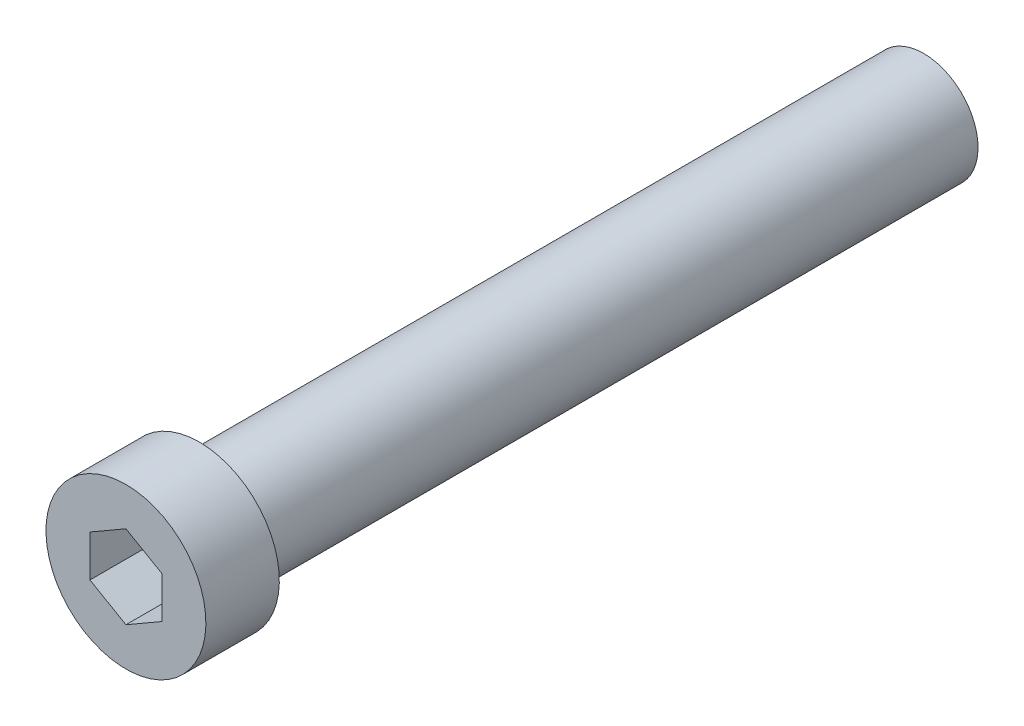
ISO-10303-21;
HEADER;
FILE_DESCRIPTION(('STEP AP214'),'2;1');
FILE_NAME('part.step','',(''),(''),'','','');
FILE_SCHEMA(('AUTOMOTIVE_DESIGN { 1 0 10303 214 1 1 1 1 }'));
ENDSEC;
DATA;
#1=APPLICATION_CONTEXT('core data for automotive mechanical design processes');
#2=APPLICATION_PROTOCOL_DEFINITION('international standard','automotive_design',2000,#1);
#3=PRODUCT_CONTEXT('',#1,'mechanical');
#4=PRODUCT('Part','Part','',(#3));
#5=PRODUCT_RELATED_PRODUCT_CATEGORY('part','',(#4));
#6=PRODUCT_DEFINITION_FORMATION('','',#4);
#7=PRODUCT_DEFINITION_CONTEXT('part definition',#1,'design');
#8=PRODUCT_DEFINITION('design','',#6,#7);
#9=PRODUCT_DEFINITION_SHAPE('','',#8);
#10=(LENGTH_UNIT() NAMED_UNIT(*) SI_UNIT(.MILLI.,.METRE.));
#11=(NAMED_UNIT(*) PLANE_ANGLE_UNIT() SI_UNIT($,.RADIAN.));
#12=(NAMED_UNIT(*) SI_UNIT($,.STERADIAN.) SOLID_ANGLE_UNIT());
#13=UNCERTAINTY_MEASURE_WITH_UNIT(LENGTH_MEASURE(1.E-05),#10,'distance_accuracy_value','');
#14=(GEOMETRIC_REPRESENTATION_CONTEXT(3) GLOBAL_UNCERTAINTY_ASSIGNED_CONTEXT((#13)) GLOBAL_UNIT_ASSIGNED_CONTEXT((#10,
#11,#12)) REPRESENTATION_CONTEXT('',''));
#15=CARTESIAN_POINT('',(0.,0.,0.));
#16=DIRECTION('',(0.,0.,1.));
#17=DIRECTION('',(1.,0.,0.));
#18=AXIS2_PLACEMENT_3D('',#15,#16,#17);
#19=CARTESIAN_POINT('',(0.,0.,2.028));
#20=DIRECTION('',(0.,0.,-1.));
#21=DIRECTION('',(0.,1.,0.));
#22=AXIS2_PLACEMENT_3D('',#19,#20,#21);
#23=CYLINDRICAL_SURFACE('',#22,2.208);
#24=CARTESIAN_POINT('',(0.,0.,2.028));
#25=DIRECTION('',(0.,0.,-1.));
#26=DIRECTION('',(0.,1.,0.));
#27=AXIS2_PLACEMENT_3D('',#24,#25,#26);
#28=CIRCLE('',#27,2.208);
#29=CARTESIAN_POINT('',(0.,2.208,2.028));
#30=VERTEX_POINT('',#29);
#31=EDGE_CURVE('E39',#30,#30,#28,.T.);
#32=ORIENTED_EDGE('',*,*,#31,.T.);
#33=EDGE_LOOP('',(#32));
#34=FACE_BOUND('',#33,.T.);
#35=CARTESIAN_POINT('',(0.,0.,0.));
#36=DIRECTION('',(0.,0.,-1.));
#37=DIRECTION('',(0.,1.,0.));
#38=AXIS2_PLACEMENT_3D('',#35,#36,#37);
#39=CIRCLE('',#38,2.208);
#40=CARTESIAN_POINT('',(0.,2.208,0.));
#41=VERTEX_POINT('',#40);
#42=EDGE_CURVE('E145',#41,#41,#39,.T.);
#43=ORIENTED_EDGE('',*,*,#42,.F.);
#44=EDGE_LOOP('',(#43));
#45=FACE_BOUND('',#44,.T.);
#46=ADVANCED_FACE('F36',(#34,#45),#23,.T.);
#47=CARTESIAN_POINT('',(2.208,0.,2.028));
#48=DIRECTION('',(0.,0.,1.));
#49=DIRECTION('',(0.,-1.,0.));
#50=AXIS2_PLACEMENT_3D('',#47,#48,#49);
#51=PLANE('',#50);
#52=DIRECTION('',(0.866025403784439,0.5,0.));
#53=VECTOR('',#52,1.);
#54=CARTESIAN_POINT('',(0.,-1.14731045493362,2.028));
#55=LINE('',#54,#53);
#56=CARTESIAN_POINT('',(0.,-1.14731045493362,2.028));
#57=VERTEX_POINT('',#56);
#58=CARTESIAN_POINT('',(0.9936,-0.573655227466812,2.028));
#59=VERTEX_POINT('',#58);
#60=EDGE_CURVE('E51',#57,#59,#55,.T.);
#61=ORIENTED_EDGE('',*,*,#60,.F.);
#62=DIRECTION('',(0.866025403784439,-0.5,0.));
#63=VECTOR('',#62,1.);
#64=CARTESIAN_POINT('',(-0.9936,-0.573655227466812,2.028));
#65=LINE('',#64,#63);
#66=CARTESIAN_POINT('',(-0.9936,-0.573655227466812,2.028));
#67=VERTEX_POINT('',#66);
#68=EDGE_CURVE('E134',#67,#57,#65,.T.);
#69=ORIENTED_EDGE('',*,*,#68,.F.);
#70=DIRECTION('',(0.,-1.,0.));
#71=VECTOR('',#70,1.);
#72=CARTESIAN_POINT('',(-0.9936,0.573655227466811,2.028));
#73=LINE('',#72,#71);
#74=CARTESIAN_POINT('',(-0.9936,0.573655227466811,2.028));
#75=VERTEX_POINT('',#74);
#76=EDGE_CURVE('E132',#75,#67,#73,.T.);
#77=ORIENTED_EDGE('',*,*,#76,.F.);
#78=DIRECTION('',(-0.866025403784438,-0.500000000000001,0.));
#79=VECTOR('',#78,1.);
#80=CARTESIAN_POINT('',(0.,1.14731045493362,2.028));
#81=LINE('',#80,#79);
#82=CARTESIAN_POINT('',(0.,1.14731045493362,2.028));
#83=VERTEX_POINT('',#82);
#84=EDGE_CURVE('E99',#83,#75,#81,.T.);
#85=ORIENTED_EDGE('',*,*,#84,.F.);
#86=DIRECTION('',(-0.866025403784438,0.500000000000001,0.));
#87=VECTOR('',#86,1.);
#88=CARTESIAN_POINT('',(0.9936,0.573655227466811,2.028));
#89=LINE('',#88,#87);
#90=CARTESIAN_POINT('',(0.9936,0.573655227466811,2.028));
#91=VERTEX_POINT('',#90);
#92=EDGE_CURVE('E128',#91,#83,#89,.T.);
#93=ORIENTED_EDGE('',*,*,#92,.F.);
#94=DIRECTION('',(0.,1.,0.));
#95=VECTOR('',#94,1.);
#96=CARTESIAN_POINT('',(0.9936,-0.573655227466812,2.028));
#97=LINE('',#96,#95);
#98=EDGE_CURVE('E125',#59,#91,#97,.T.);
#99=ORIENTED_EDGE('',*,*,#98,.F.);
#100=EDGE_LOOP('',(#61,#69,#77,#85,#93,#99));
#101=FACE_BOUND('',#100,.T.);
#102=ORIENTED_EDGE('',*,*,#31,.F.);
#103=EDGE_LOOP('',(#102));
#104=FACE_BOUND('',#103,.T.);
#105=ADVANCED_FACE('F154',(#101,#104),#51,.T.);
#106=CARTESIAN_POINT('',(0.,0.,0.));
#107=DIRECTION('',(0.,0.,-1.));
#108=DIRECTION('',(0.,1.,0.));
#109=AXIS2_PLACEMENT_3D('',#106,#107,#108);
#110=PLANE('',#109);
#111=CARTESIAN_POINT('',(0.,0.,0.));
#112=DIRECTION('',(0.,0.,-1.));
#113=DIRECTION('',(0.,1.,0.));
#114=AXIS2_PLACEMENT_3D('',#111,#112,#113);
#115=CIRCLE('',#114,1.50000000000006);
#116=CARTESIAN_POINT('',(0.,1.50000000000006,0.));
#117=VERTEX_POINT('',#116);
#118=EDGE_CURVE('E11',#117,#117,#115,.T.);
#119=ORIENTED_EDGE('',*,*,#118,.F.);
#120=EDGE_LOOP('',(#119));
#121=FACE_BOUND('',#120,.T.);
#122=ORIENTED_EDGE('',*,*,#42,.T.);
#123=EDGE_LOOP('',(#122));
#124=FACE_BOUND('',#123,.T.);
#125=ADVANCED_FACE('F156',(#121,#124),#110,.T.);
#126=CARTESIAN_POINT('',(0.,0.,-20.));
#127=DIRECTION('',(0.,0.,1.));
#128=DIRECTION('',(0.,-1.,0.));
#129=AXIS2_PLACEMENT_3D('',#126,#127,#128);
#130=CYLINDRICAL_SURFACE('',#129,1.50000000000006);
#131=CARTESIAN_POINT('',(0.,0.,-20.));
#132=DIRECTION('',(0.,0.,-1.));
#133=DIRECTION('',(0.,1.,0.));
#134=AXIS2_PLACEMENT_3D('',#131,#132,#133);
#135=CIRCLE('',#134,1.50000000000006);
#136=CARTESIAN_POINT('',(0.,1.50000000000005,-20.));
#137=VERTEX_POINT('',#136);
#138=EDGE_CURVE('E138',#137,#137,#135,.T.);
#139=ORIENTED_EDGE('',*,*,#138,.F.);
#140=EDGE_LOOP('',(#139));
#141=FACE_BOUND('',#140,.T.);
#142=ORIENTED_EDGE('',*,*,#118,.T.);
#143=EDGE_LOOP('',(#142));
#144=FACE_BOUND('',#143,.T.);
#145=ADVANCED_FACE('F162',(#141,#144),#130,.T.);
#146=CARTESIAN_POINT('',(0.,0.,-20.));
#147=DIRECTION('',(0.,0.,-1.));
#148=DIRECTION('',(0.,1.,0.));
#149=AXIS2_PLACEMENT_3D('',#146,#147,#148);
#150=PLANE('',#149);
#151=ORIENTED_EDGE('',*,*,#138,.T.);
#152=EDGE_LOOP('',(#151));
#153=FACE_BOUND('',#152,.T.);
#154=ADVANCED_FACE('F168',(#153),#150,.T.);
#155=CARTESIAN_POINT('',(0.,-1.14731045493362,0.156));
#156=DIRECTION('',(0.5,-0.866025403784439,0.));
#157=DIRECTION('',(0.866025403784439,0.5,0.));
#158=AXIS2_PLACEMENT_3D('',#155,#156,#157);
#159=PLANE('',#158);
#160=ORIENTED_EDGE('',*,*,#60,.T.);
#161=DIRECTION('',(0.,0.,1.));
#162=VECTOR('',#161,1.);
#163=CARTESIAN_POINT('',(0.9936,-0.573655227466812,0.156));
#164=LINE('',#163,#162);
#165=CARTESIAN_POINT('',(0.9936,-0.573655227466812,0.156));
#166=VERTEX_POINT('',#165);
#167=EDGE_CURVE('E81',#166,#59,#164,.T.);
#168=ORIENTED_EDGE('',*,*,#167,.F.);
#169=DIRECTION('',(0.866025403784439,0.5,0.));
#170=VECTOR('',#169,1.);
#171=CARTESIAN_POINT('',(0.,-1.14731045493362,0.156));
#172=LINE('',#171,#170);
#173=CARTESIAN_POINT('',(0.,-1.14731045493362,0.156));
#174=VERTEX_POINT('',#173);
#175=EDGE_CURVE('E136',#174,#166,#172,.T.);
#176=ORIENTED_EDGE('',*,*,#175,.F.);
#177=DIRECTION('',(0.,0.,1.));
#178=VECTOR('',#177,1.);
#179=CARTESIAN_POINT('',(0.,-1.14731045493362,0.156));
#180=LINE('',#179,#178);
#181=EDGE_CURVE('E59',#174,#57,#180,.T.);
#182=ORIENTED_EDGE('',*,*,#181,.T.);
#183=EDGE_LOOP('',(#160,#168,#176,#182));
#184=FACE_BOUND('',#183,.T.);
#185=ADVANCED_FACE('F172',(#184),#159,.F.);
#186=CARTESIAN_POINT('',(-0.9936,-0.573655227466812,0.156));
#187=DIRECTION('',(-0.5,-0.866025403784439,0.));
#188=DIRECTION('',(0.866025403784439,-0.5,0.));
#189=AXIS2_PLACEMENT_3D('',#186,#187,#188);
#190=PLANE('',#189);
#191=ORIENTED_EDGE('',*,*,#68,.T.);
#192=ORIENTED_EDGE('',*,*,#181,.F.);
#193=DIRECTION('',(0.866025403784439,-0.5,0.));
#194=VECTOR('',#193,1.);
#195=CARTESIAN_POINT('',(-0.9936,-0.573655227466812,0.156));
#196=LINE('',#195,#194);
#197=CARTESIAN_POINT('',(-0.9936,-0.573655227466812,0.156));
#198=VERTEX_POINT('',#197);
#199=EDGE_CURVE('E111',#198,#174,#196,.T.);
#200=ORIENTED_EDGE('',*,*,#199,.F.);
#201=DIRECTION('',(0.,0.,1.));
#202=VECTOR('',#201,1.);
#203=CARTESIAN_POINT('',(-0.9936,-0.573655227466812,0.156));
#204=LINE('',#203,#202);
#205=EDGE_CURVE('E103',#198,#67,#204,.T.);
#206=ORIENTED_EDGE('',*,*,#205,.T.);
#207=EDGE_LOOP('',(#191,#192,#200,#206));
#208=FACE_BOUND('',#207,.T.);
#209=ADVANCED_FACE('F176',(#208),#190,.F.);
#210=CARTESIAN_POINT('',(-0.9936,0.573655227466811,0.156));
#211=DIRECTION('',(-1.,0.,0.));
#212=DIRECTION('',(0.,0.,1.));
#213=AXIS2_PLACEMENT_3D('',#210,#211,#212);
#214=PLANE('',#213);
#215=ORIENTED_EDGE('',*,*,#76,.T.);
#216=ORIENTED_EDGE('',*,*,#205,.F.);
#217=DIRECTION('',(0.,-1.,0.));
#218=VECTOR('',#217,1.);
#219=CARTESIAN_POINT('',(-0.9936,0.573655227466811,0.156));
#220=LINE('',#219,#218);
#221=CARTESIAN_POINT('',(-0.9936,0.573655227466811,0.156));
#222=VERTEX_POINT('',#221);
#223=EDGE_CURVE('E107',#222,#198,#220,.T.);
#224=ORIENTED_EDGE('',*,*,#223,.F.);
#225=DIRECTION('',(0.,0.,1.));
#226=VECTOR('',#225,1.);
#227=CARTESIAN_POINT('',(-0.9936,0.573655227466811,0.156));
#228=LINE('',#227,#226);
#229=EDGE_CURVE('E92',#222,#75,#228,.T.);
#230=ORIENTED_EDGE('',*,*,#229,.T.);
#231=EDGE_LOOP('',(#215,#216,#224,#230));
#232=FACE_BOUND('',#231,.T.);
#233=ADVANCED_FACE('F108',(#232),#214,.F.);
#234=CARTESIAN_POINT('',(0.,1.14731045493362,0.156));
#235=DIRECTION('',(-0.500000000000001,0.866025403784438,0.));
#236=DIRECTION('',(-0.866025403784438,-0.500000000000001,0.));
#237=AXIS2_PLACEMENT_3D('',#234,#235,#236);
#238=PLANE('',#237);
#239=ORIENTED_EDGE('',*,*,#84,.T.);
#240=ORIENTED_EDGE('',*,*,#229,.F.);
#241=DIRECTION('',(-0.866025403784438,-0.500000000000001,0.));
#242=VECTOR('',#241,1.);
#243=CARTESIAN_POINT('',(0.,1.14731045493362,0.156));
#244=LINE('',#243,#242);
#245=CARTESIAN_POINT('',(0.,1.14731045493362,0.156));
#246=VERTEX_POINT('',#245);
#247=EDGE_CURVE('E96',#246,#222,#244,.T.);
#248=ORIENTED_EDGE('',*,*,#247,.F.);
#249=DIRECTION('',(0.,0.,1.));
#250=VECTOR('',#249,1.);
#251=CARTESIAN_POINT('',(0.,1.14731045493362,0.156));
#252=LINE('',#251,#250);
#253=EDGE_CURVE('E104',#246,#83,#252,.T.);
#254=ORIENTED_EDGE('',*,*,#253,.T.);
#255=EDGE_LOOP('',(#239,#240,#248,#254));
#256=FACE_BOUND('',#255,.T.);
#257=ADVANCED_FACE('F94',(#256),#238,.F.);
#258=CARTESIAN_POINT('',(0.9936,0.573655227466811,0.156));
#259=DIRECTION('',(0.500000000000001,0.866025403784438,0.));
#260=DIRECTION('',(-0.866025403784438,0.500000000000001,0.));
#261=AXIS2_PLACEMENT_3D('',#258,#259,#260);
#262=PLANE('',#261);
#263=ORIENTED_EDGE('',*,*,#92,.T.);
#264=ORIENTED_EDGE('',*,*,#253,.F.);
#265=DIRECTION('',(-0.866025403784438,0.500000000000001,0.));
#266=VECTOR('',#265,1.);
#267=CARTESIAN_POINT('',(0.9936,0.573655227466811,0.156));
#268=LINE('',#267,#266);
#269=CARTESIAN_POINT('',(0.9936,0.573655227466811,0.156));
#270=VERTEX_POINT('',#269);
#271=EDGE_CURVE('E117',#270,#246,#268,.T.);
#272=ORIENTED_EDGE('',*,*,#271,.F.);
#273=DIRECTION('',(0.,0.,1.));
#274=VECTOR('',#273,1.);
#275=CARTESIAN_POINT('',(0.9936,0.573655227466811,0.156));
#276=LINE('',#275,#274);
#277=EDGE_CURVE('E141',#270,#91,#276,.T.);
#278=ORIENTED_EDGE('',*,*,#277,.T.);
#279=EDGE_LOOP('',(#263,#264,#272,#278));
#280=FACE_BOUND('',#279,.T.);
#281=ADVANCED_FACE('F180',(#280),#262,.F.);
#282=CARTESIAN_POINT('',(0.9936,-0.573655227466812,0.156));
#283=DIRECTION('',(1.,0.,0.));
#284=DIRECTION('',(0.,0.,-1.));
#285=AXIS2_PLACEMENT_3D('',#282,#283,#284);
#286=PLANE('',#285);
#287=ORIENTED_EDGE('',*,*,#98,.T.);
#288=ORIENTED_EDGE('',*,*,#277,.F.);
#289=DIRECTION('',(0.,1.,0.));
#290=VECTOR('',#289,1.);
#291=CARTESIAN_POINT('',(0.9936,-0.573655227466812,0.156));
#292=LINE('',#291,#290);
#293=EDGE_CURVE('E119',#166,#270,#292,.T.);
#294=ORIENTED_EDGE('',*,*,#293,.F.);
#295=ORIENTED_EDGE('',*,*,#167,.T.);
#296=EDGE_LOOP('',(#287,#288,#294,#295));
#297=FACE_BOUND('',#296,.T.);
#298=ADVANCED_FACE('F177',(#297),#286,.F.);
#299=CARTESIAN_POINT('',(0.,0.,0.156));
#300=DIRECTION('',(0.,0.,1.));
#301=DIRECTION('',(1.,0.,0.));
#302=AXIS2_PLACEMENT_3D('',#299,#300,#301);
#303=PLANE('',#302);
#304=ORIENTED_EDGE('',*,*,#175,.T.);
#305=ORIENTED_EDGE('',*,*,#293,.T.);
#306=ORIENTED_EDGE('',*,*,#271,.T.);
#307=ORIENTED_EDGE('',*,*,#247,.T.);
#308=ORIENTED_EDGE('',*,*,#223,.T.);
#309=ORIENTED_EDGE('',*,*,#199,.T.);
#310=EDGE_LOOP('',(#304,#305,#306,#307,#308,#309));
#311=FACE_BOUND('',#310,.T.);
#312=ADVANCED_FACE('F114',(#311),#303,.T.);
#313=CLOSED_SHELL('',(#46,#105,#125,#145,#154,#185,#209,#233,#257,#281,#298,#312));
#314=MANIFOLD_SOLID_BREP('B2',#313);
#315=ADVANCED_BREP_SHAPE_REPRESENTATION('',(#18,#314),#14);
#316=SHAPE_DEFINITION_REPRESENTATION(#9,#315);
ENDSEC;
END-ISO-10303-21;
